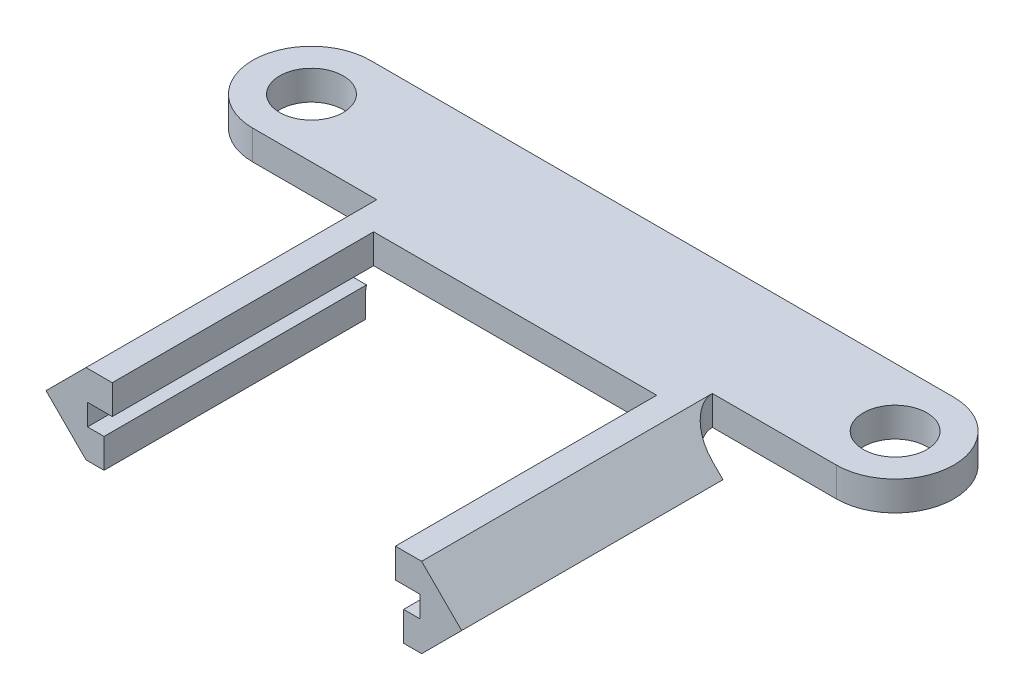
ISO-10303-21;
HEADER;
FILE_DESCRIPTION(('STEP AP214'),'2;1');
FILE_NAME('part.step','',(''),(''),'','','');
FILE_SCHEMA(('AUTOMOTIVE_DESIGN { 1 0 10303 214 1 1 1 1 }'));
ENDSEC;
DATA;
#1=APPLICATION_CONTEXT('core data for automotive mechanical design processes');
#2=APPLICATION_PROTOCOL_DEFINITION('international standard','automotive_design',2000,#1);
#3=PRODUCT_CONTEXT('',#1,'mechanical');
#4=PRODUCT('Part','Part','',(#3));
#5=PRODUCT_RELATED_PRODUCT_CATEGORY('part','',(#4));
#6=PRODUCT_DEFINITION_FORMATION('','',#4);
#7=PRODUCT_DEFINITION_CONTEXT('part definition',#1,'design');
#8=PRODUCT_DEFINITION('design','',#6,#7);
#9=PRODUCT_DEFINITION_SHAPE('','',#8);
#10=(LENGTH_UNIT() NAMED_UNIT(*) SI_UNIT(.MILLI.,.METRE.));
#11=(NAMED_UNIT(*) PLANE_ANGLE_UNIT() SI_UNIT($,.RADIAN.));
#12=(NAMED_UNIT(*) SI_UNIT($,.STERADIAN.) SOLID_ANGLE_UNIT());
#13=UNCERTAINTY_MEASURE_WITH_UNIT(LENGTH_MEASURE(1.E-05),#10,'distance_accuracy_value','');
#14=(GEOMETRIC_REPRESENTATION_CONTEXT(3) GLOBAL_UNCERTAINTY_ASSIGNED_CONTEXT((#13)) GLOBAL_UNIT_ASSIGNED_CONTEXT((#10,
#11,#12)) REPRESENTATION_CONTEXT('',''));
#15=CARTESIAN_POINT('',(0.,0.,0.));
#16=DIRECTION('',(0.,0.,1.));
#17=DIRECTION('',(1.,0.,0.));
#18=AXIS2_PLACEMENT_3D('',#15,#16,#17);
#19=CARTESIAN_POINT('',(0.,0.,0.));
#20=DIRECTION('',(0.,0.,-1.));
#21=DIRECTION('',(-1.,0.,0.));
#22=AXIS2_PLACEMENT_3D('',#19,#20,#21);
#23=PLANE('',#22);
#24=DIRECTION('',(0.,1.,0.));
#25=VECTOR('',#24,1.);
#26=CARTESIAN_POINT('',(26.416,0.,0.));
#27=LINE('',#26,#25);
#28=CARTESIAN_POINT('',(26.416,-2.54,0.));
#29=VERTEX_POINT('',#28);
#30=CARTESIAN_POINT('',(26.416,-0.6985,0.));
#31=VERTEX_POINT('',#30);
#32=EDGE_CURVE('E306',#29,#31,#27,.T.);
#33=ORIENTED_EDGE('',*,*,#32,.T.);
#34=DIRECTION('',(-1.,0.,0.));
#35=VECTOR('',#34,1.);
#36=CARTESIAN_POINT('',(27.9761024484277,-0.6985,0.));
#37=LINE('',#36,#35);
#38=CARTESIAN_POINT('',(29.8176024484277,-0.6985,0.));
#39=VERTEX_POINT('',#38);
#40=EDGE_CURVE('E397',#31,#39,#37,.F.);
#41=ORIENTED_EDGE('',*,*,#40,.T.);
#42=DIRECTION('',(0.707106781186548,0.707106781186547,0.));
#43=VECTOR('',#42,1.);
#44=CARTESIAN_POINT('',(27.9761024484277,-2.54,0.));
#45=LINE('',#44,#43);
#46=CARTESIAN_POINT('',(27.9761024484277,-2.54,0.));
#47=VERTEX_POINT('',#46);
#48=EDGE_CURVE('E345',#47,#39,#45,.T.);
#49=ORIENTED_EDGE('',*,*,#48,.F.);
#50=DIRECTION('',(1.,0.,0.));
#51=VECTOR('',#50,1.);
#52=CARTESIAN_POINT('',(26.0985,-2.54,0.));
#53=LINE('',#52,#51);
#54=EDGE_CURVE('E363',#29,#47,#53,.T.);
#55=ORIENTED_EDGE('',*,*,#54,.F.);
#56=EDGE_LOOP('',(#33,#41,#49,#55));
#57=FACE_BOUND('',#56,.T.);
#58=ADVANCED_FACE('F34',(#57),#23,.T.);
#59=DIRECTION('',(0.707106781186548,-0.707106781186547,0.));
#60=VECTOR('',#59,1.);
#61=CARTESIAN_POINT('',(-1.05210244842766,-2.54,0.));
#62=LINE('',#61,#60);
#63=CARTESIAN_POINT('',(-2.89360244842766,-0.6985,0.));
#64=VERTEX_POINT('',#63);
#65=CARTESIAN_POINT('',(-1.05210244842766,-2.54,0.));
#66=VERTEX_POINT('',#65);
#67=EDGE_CURVE('E340',#64,#66,#62,.T.);
#68=ORIENTED_EDGE('',*,*,#67,.F.);
#69=DIRECTION('',(-1.,0.,0.));
#70=VECTOR('',#69,1.);
#71=CARTESIAN_POINT('',(-0.920750000000008,-0.6985,0.));
#72=LINE('',#71,#70);
#73=CARTESIAN_POINT('',(0.507999999999999,-0.6985,0.));
#74=VERTEX_POINT('',#73);
#75=EDGE_CURVE('E391',#64,#74,#72,.F.);
#76=ORIENTED_EDGE('',*,*,#75,.T.);
#77=DIRECTION('',(0.,-1.,0.));
#78=VECTOR('',#77,1.);
#79=CARTESIAN_POINT('',(0.508,0.,0.));
#80=LINE('',#79,#78);
#81=CARTESIAN_POINT('',(0.507999999999998,-2.54,0.));
#82=VERTEX_POINT('',#81);
#83=EDGE_CURVE('E304',#74,#82,#80,.T.);
#84=ORIENTED_EDGE('',*,*,#83,.T.);
#85=EDGE_CURVE('E364',#66,#82,#53,.T.);
#86=ORIENTED_EDGE('',*,*,#85,.F.);
#87=EDGE_LOOP('',(#68,#76,#84,#86));
#88=FACE_BOUND('',#87,.T.);
#89=ADVANCED_FACE('F488',(#88),#23,.T.);
#90=CARTESIAN_POINT('',(31.4368524484277,0.920749999999997,22.606));
#91=DIRECTION('',(-0.707106781186548,-0.707106781186547,0.));
#92=DIRECTION('',(0.707106781186547,-0.707106781186548,0.));
#93=AXIS2_PLACEMENT_3D('',#90,#91,#92);
#94=PLANE('',#93);
#95=DIRECTION('',(-0.707106781186547,0.707106781186548,0.));
#96=VECTOR('',#95,1.);
#97=CARTESIAN_POINT('',(27.9761024484277,4.3815,0.));
#98=LINE('',#97,#96);
#99=CARTESIAN_POINT('',(31.4368524484277,0.920749999999997,0.));
#100=VERTEX_POINT('',#99);
#101=CARTESIAN_POINT('',(30.5161024484277,1.8415,0.));
#102=VERTEX_POINT('',#101);
#103=EDGE_CURVE('E267',#100,#102,#98,.T.);
#104=ORIENTED_EDGE('',*,*,#103,.T.);
#105=CARTESIAN_POINT('',(30.5161024484277,1.8415,-2.54));
#106=DIRECTION('',(-0.707106781186548,-0.707106781186547,0.));
#107=DIRECTION('',(0.707106781186547,-0.707106781186548,0.));
#108=AXIS2_PLACEMENT_3D('',#105,#106,#107);
#109=ELLIPSE('',#108,3.59210244842766,2.54);
#110=CARTESIAN_POINT('',(27.9761024484277,4.3815,-2.54));
#111=VERTEX_POINT('',#110);
#112=EDGE_CURVE('E12',#102,#111,#109,.T.);
#113=ORIENTED_EDGE('',*,*,#112,.T.);
#114=DIRECTION('',(0.,0.,-1.));
#115=VECTOR('',#114,1.);
#116=CARTESIAN_POINT('',(27.9761024484277,4.3815,22.606));
#117=LINE('',#116,#115);
#118=CARTESIAN_POINT('',(27.9761024484277,4.3815,22.606));
#119=VERTEX_POINT('',#118);
#120=EDGE_CURVE('E51',#119,#111,#117,.T.);
#121=ORIENTED_EDGE('',*,*,#120,.F.);
#122=DIRECTION('',(-0.707106781186547,0.707106781186548,0.));
#123=VECTOR('',#122,1.);
#124=CARTESIAN_POINT('',(31.4368524484277,0.920749999999997,22.606));
#125=LINE('',#124,#123);
#126=CARTESIAN_POINT('',(31.4368524484277,0.920749999999997,22.606));
#127=VERTEX_POINT('',#126);
#128=EDGE_CURVE('E351',#127,#119,#125,.T.);
#129=ORIENTED_EDGE('',*,*,#128,.F.);
#130=DIRECTION('',(0.,0.,-1.));
#131=VECTOR('',#130,1.);
#132=CARTESIAN_POINT('',(31.4368524484277,0.920749999999997,22.606));
#133=LINE('',#132,#131);
#134=EDGE_CURVE('E376',#127,#100,#133,.T.);
#135=ORIENTED_EDGE('',*,*,#134,.T.);
#136=EDGE_LOOP('',(#104,#113,#121,#129,#135));
#137=FACE_BOUND('',#136,.T.);
#138=ADVANCED_FACE('F495',(#137),#94,.F.);
#139=CARTESIAN_POINT('',(-4.51285244842766,0.920749999999996,22.606));
#140=DIRECTION('',(0.707106781186548,-0.707106781186547,0.));
#141=DIRECTION('',(0.707106781186547,0.707106781186548,0.));
#142=AXIS2_PLACEMENT_3D('',#139,#140,#141);
#143=PLANE('',#142);
#144=DIRECTION('',(0.,0.,-1.));
#145=VECTOR('',#144,1.);
#146=CARTESIAN_POINT('',(-1.05210244842766,4.3815,22.606));
#147=LINE('',#146,#145);
#148=CARTESIAN_POINT('',(-1.05210244842766,4.3815,22.606));
#149=VERTEX_POINT('',#148);
#150=CARTESIAN_POINT('',(-1.05210244842767,4.3815,-2.53999999999999));
#151=VERTEX_POINT('',#150);
#152=EDGE_CURVE('E372',#149,#151,#147,.T.);
#153=ORIENTED_EDGE('',*,*,#152,.T.);
#154=CARTESIAN_POINT('',(-3.59210244842767,1.84149999999999,-2.54));
#155=DIRECTION('',(0.707106781186548,-0.707106781186547,0.));
#156=DIRECTION('',(0.707106781186547,0.707106781186548,0.));
#157=AXIS2_PLACEMENT_3D('',#154,#155,#156);
#158=ELLIPSE('',#157,3.59210244842766,2.54);
#159=CARTESIAN_POINT('',(-3.59210244842767,1.8415,0.));
#160=VERTEX_POINT('',#159);
#161=EDGE_CURVE('E413',#151,#160,#158,.T.);
#162=ORIENTED_EDGE('',*,*,#161,.T.);
#163=DIRECTION('',(-0.707106781186547,-0.707106781186548,0.));
#164=VECTOR('',#163,1.);
#165=CARTESIAN_POINT('',(-1.05210244842767,4.3815,0.));
#166=LINE('',#165,#164);
#167=CARTESIAN_POINT('',(-4.51285244842766,0.920750000000001,0.));
#168=VERTEX_POINT('',#167);
#169=EDGE_CURVE('E271',#160,#168,#166,.T.);
#170=ORIENTED_EDGE('',*,*,#169,.T.);
#171=DIRECTION('',(0.,0.,-1.));
#172=VECTOR('',#171,1.);
#173=CARTESIAN_POINT('',(-4.51285244842766,0.920749999999996,22.606));
#174=LINE('',#173,#172);
#175=CARTESIAN_POINT('',(-4.51285244842766,0.920749999999996,22.606));
#176=VERTEX_POINT('',#175);
#177=EDGE_CURVE('E359',#176,#168,#174,.T.);
#178=ORIENTED_EDGE('',*,*,#177,.F.);
#179=DIRECTION('',(-0.707106781186547,-0.707106781186548,0.));
#180=VECTOR('',#179,1.);
#181=CARTESIAN_POINT('',(-4.51285244842766,0.920749999999996,22.606));
#182=LINE('',#181,#180);
#183=EDGE_CURVE('E357',#149,#176,#182,.T.);
#184=ORIENTED_EDGE('',*,*,#183,.F.);
#185=EDGE_LOOP('',(#153,#162,#170,#178,#184));
#186=FACE_BOUND('',#185,.T.);
#187=ADVANCED_FACE('F538',(#186),#143,.F.);
#188=CARTESIAN_POINT('',(27.84475,1.8415,22.606));
#189=DIRECTION('',(-1.,0.,0.));
#190=DIRECTION('',(0.,0.,1.));
#191=AXIS2_PLACEMENT_3D('',#188,#189,#190);
#192=PLANE('',#191);
#193=DIRECTION('',(0.,0.,-1.));
#194=VECTOR('',#193,1.);
#195=CARTESIAN_POINT('',(27.84475,1.8415,22.606));
#196=LINE('',#195,#194);
#197=CARTESIAN_POINT('',(27.84475,1.8415,22.606));
#198=VERTEX_POINT('',#197);
#199=CARTESIAN_POINT('',(27.84475,1.8415,-2.53999999999999));
#200=VERTEX_POINT('',#199);
#201=EDGE_CURVE('E336',#198,#200,#196,.T.);
#202=ORIENTED_EDGE('',*,*,#201,.T.);
#203=CARTESIAN_POINT('',(27.84475,-0.6985,-2.54));
#204=DIRECTION('',(-1.,0.,0.));
#205=DIRECTION('',(0.,0.,1.));
#206=AXIS2_PLACEMENT_3D('',#203,#204,#205);
#207=CIRCLE('',#206,2.54);
#208=CARTESIAN_POINT('',(27.84475,0.,-0.0979316655752571));
#209=VERTEX_POINT('',#208);
#210=EDGE_CURVE('E417',#200,#209,#207,.F.);
#211=ORIENTED_EDGE('',*,*,#210,.T.);
#212=DIRECTION('',(0.,0.,-1.));
#213=VECTOR('',#212,1.);
#214=CARTESIAN_POINT('',(27.84475,0.,22.606));
#215=LINE('',#214,#213);
#216=CARTESIAN_POINT('',(27.84475,0.,22.606));
#217=VERTEX_POINT('',#216);
#218=EDGE_CURVE('E338',#217,#209,#215,.T.);
#219=ORIENTED_EDGE('',*,*,#218,.F.);
#220=DIRECTION('',(0.,1.,0.));
#221=VECTOR('',#220,1.);
#222=CARTESIAN_POINT('',(27.84475,1.8415,22.606));
#223=LINE('',#222,#221);
#224=EDGE_CURVE('E324',#217,#198,#223,.T.);
#225=ORIENTED_EDGE('',*,*,#224,.T.);
#226=EDGE_LOOP('',(#202,#211,#219,#225));
#227=FACE_BOUND('',#226,.T.);
#228=ADVANCED_FACE('F564',(#227),#192,.T.);
#229=CARTESIAN_POINT('',(-0.920750000000006,1.8415,22.606));
#230=DIRECTION('',(1.,0.,0.));
#231=DIRECTION('',(0.,0.,-1.));
#232=AXIS2_PLACEMENT_3D('',#229,#230,#231);
#233=PLANE('',#232);
#234=DIRECTION('',(0.,0.,-1.));
#235=VECTOR('',#234,1.);
#236=CARTESIAN_POINT('',(-0.920750000000006,0.,22.606));
#237=LINE('',#236,#235);
#238=CARTESIAN_POINT('',(-0.920750000000006,0.,22.606));
#239=VERTEX_POINT('',#238);
#240=CARTESIAN_POINT('',(-0.920750000000006,0.,-0.0979316655752571));
#241=VERTEX_POINT('',#240);
#242=EDGE_CURVE('E332',#239,#241,#237,.T.);
#243=ORIENTED_EDGE('',*,*,#242,.T.);
#244=CARTESIAN_POINT('',(-0.920750000000006,-0.6985,-2.54));
#245=DIRECTION('',(1.,0.,0.));
#246=DIRECTION('',(0.,0.,-1.));
#247=AXIS2_PLACEMENT_3D('',#244,#245,#246);
#248=CIRCLE('',#247,2.54);
#249=CARTESIAN_POINT('',(-0.920750000000006,1.8415,-2.53999999999999));
#250=VERTEX_POINT('',#249);
#251=EDGE_CURVE('E410',#241,#250,#248,.F.);
#252=ORIENTED_EDGE('',*,*,#251,.T.);
#253=DIRECTION('',(0.,0.,-1.));
#254=VECTOR('',#253,1.);
#255=CARTESIAN_POINT('',(-0.920750000000006,1.8415,22.606));
#256=LINE('',#255,#254);
#257=CARTESIAN_POINT('',(-0.920750000000006,1.8415,22.606));
#258=VERTEX_POINT('',#257);
#259=EDGE_CURVE('E334',#258,#250,#256,.T.);
#260=ORIENTED_EDGE('',*,*,#259,.F.);
#261=DIRECTION('',(0.,-1.,0.));
#262=VECTOR('',#261,1.);
#263=CARTESIAN_POINT('',(-0.920750000000006,1.8415,22.606));
#264=LINE('',#263,#262);
#265=EDGE_CURVE('E330',#258,#239,#264,.T.);
#266=ORIENTED_EDGE('',*,*,#265,.T.);
#267=EDGE_LOOP('',(#243,#252,#260,#266));
#268=FACE_BOUND('',#267,.T.);
#269=ADVANCED_FACE('F524',(#268),#233,.T.);
#270=CARTESIAN_POINT('',(0.,0.,22.606));
#271=DIRECTION('',(0.,0.,-1.));
#272=DIRECTION('',(-1.,0.,0.));
#273=AXIS2_PLACEMENT_3D('',#270,#271,#272);
#274=PLANE('',#273);
#275=DIRECTION('',(-1.,0.,0.));
#276=VECTOR('',#275,1.);
#277=CARTESIAN_POINT('',(26.924,1.8415,22.606));
#278=LINE('',#277,#276);
#279=CARTESIAN_POINT('',(1.2192,1.8415,22.606));
#280=VERTEX_POINT('',#279);
#281=EDGE_CURVE('E326',#280,#258,#278,.T.);
#282=ORIENTED_EDGE('',*,*,#281,.F.);
#283=DIRECTION('',(0.,1.,0.));
#284=VECTOR('',#283,1.);
#285=CARTESIAN_POINT('',(1.2192,1.8415,22.606));
#286=LINE('',#285,#284);
#287=CARTESIAN_POINT('',(1.2192,4.3815,22.606));
#288=VERTEX_POINT('',#287);
#289=EDGE_CURVE('E284',#280,#288,#286,.T.);
#290=ORIENTED_EDGE('',*,*,#289,.T.);
#291=DIRECTION('',(-1.,0.,0.));
#292=VECTOR('',#291,1.);
#293=CARTESIAN_POINT('',(26.0985,4.3815,22.606));
#294=LINE('',#293,#292);
#295=EDGE_CURVE('E353',#288,#149,#294,.T.);
#296=ORIENTED_EDGE('',*,*,#295,.T.);
#297=ORIENTED_EDGE('',*,*,#183,.T.);
#298=DIRECTION('',(0.707106781186548,-0.707106781186547,0.));
#299=VECTOR('',#298,1.);
#300=CARTESIAN_POINT('',(-1.05210244842766,-2.54,22.606));
#301=LINE('',#300,#299);
#302=CARTESIAN_POINT('',(-1.05210244842766,-2.54,22.606));
#303=VERTEX_POINT('',#302);
#304=EDGE_CURVE('E341',#176,#303,#301,.T.);
#305=ORIENTED_EDGE('',*,*,#304,.T.);
#306=DIRECTION('',(1.,0.,0.));
#307=VECTOR('',#306,1.);
#308=CARTESIAN_POINT('',(0.825500000000002,-2.54,22.606));
#309=LINE('',#308,#307);
#310=CARTESIAN_POINT('',(0.507999999999998,-2.54,22.606));
#311=VERTEX_POINT('',#310);
#312=EDGE_CURVE('E346',#303,#311,#309,.T.);
#313=ORIENTED_EDGE('',*,*,#312,.T.);
#314=DIRECTION('',(0.,-1.,0.));
#315=VECTOR('',#314,1.);
#316=CARTESIAN_POINT('',(0.508,0.,22.606));
#317=LINE('',#316,#315);
#318=CARTESIAN_POINT('',(0.508,0.,22.606));
#319=VERTEX_POINT('',#318);
#320=EDGE_CURVE('E303',#319,#311,#317,.T.);
#321=ORIENTED_EDGE('',*,*,#320,.F.);
#322=DIRECTION('',(1.,0.,0.));
#323=VECTOR('',#322,1.);
#324=CARTESIAN_POINT('',(-0.920750000000006,0.,22.606));
#325=LINE('',#324,#323);
#326=EDGE_CURVE('E321',#239,#319,#325,.T.);
#327=ORIENTED_EDGE('',*,*,#326,.F.);
#328=ORIENTED_EDGE('',*,*,#265,.F.);
#329=EDGE_LOOP('',(#282,#290,#296,#297,#305,#313,#321,#327,#328));
#330=FACE_BOUND('',#329,.T.);
#331=ADVANCED_FACE('F513',(#330),#274,.F.);
#332=ORIENTED_EDGE('',*,*,#169,.F.);
#333=DIRECTION('',(0.,1.,0.));
#334=VECTOR('',#333,1.);
#335=CARTESIAN_POINT('',(-3.59210244842767,0.,0.));
#336=LINE('',#335,#334);
#337=CARTESIAN_POINT('',(-3.59210244842767,0.,0.));
#338=VERTEX_POINT('',#337);
#339=EDGE_CURVE('E389',#160,#338,#336,.F.);
#340=ORIENTED_EDGE('',*,*,#339,.T.);
#341=EDGE_CURVE('E360',#168,#338,#62,.T.);
#342=ORIENTED_EDGE('',*,*,#341,.F.);
#343=EDGE_LOOP('',(#332,#340,#342));
#344=FACE_BOUND('',#343,.T.);
#345=ADVANCED_FACE('F497',(#344),#23,.T.);
#346=CARTESIAN_POINT('',(26.0985,-2.54,22.606));
#347=DIRECTION('',(0.,1.,0.));
#348=DIRECTION('',(0.,0.,1.));
#349=AXIS2_PLACEMENT_3D('',#346,#347,#348);
#350=PLANE('',#349);
#351=ORIENTED_EDGE('',*,*,#85,.T.);
#352=DIRECTION('',(0.,0.,1.));
#353=VECTOR('',#352,1.);
#354=CARTESIAN_POINT('',(0.507999999999998,-2.54,0.));
#355=LINE('',#354,#353);
#356=EDGE_CURVE('E310',#82,#311,#355,.T.);
#357=ORIENTED_EDGE('',*,*,#356,.T.);
#358=ORIENTED_EDGE('',*,*,#312,.F.);
#359=DIRECTION('',(0.,0.,-1.));
#360=VECTOR('',#359,1.);
#361=CARTESIAN_POINT('',(-1.05210244842766,-2.54,22.606));
#362=LINE('',#361,#360);
#363=EDGE_CURVE('E382',#303,#66,#362,.T.);
#364=ORIENTED_EDGE('',*,*,#363,.T.);
#365=EDGE_LOOP('',(#351,#357,#358,#364));
#366=FACE_BOUND('',#365,.T.);
#367=ADVANCED_FACE('F516',(#366),#350,.F.);
#368=CARTESIAN_POINT('',(27.84475,0.,22.606));
#369=DIRECTION('',(0.,1.,0.));
#370=DIRECTION('',(0.,0.,1.));
#371=AXIS2_PLACEMENT_3D('',#368,#369,#370);
#372=PLANE('',#371);
#373=DIRECTION('',(0.,0.,1.));
#374=VECTOR('',#373,1.);
#375=CARTESIAN_POINT('',(0.508,0.,0.));
#376=LINE('',#375,#374);
#377=CARTESIAN_POINT('',(0.508,0.,-0.0979316655752647));
#378=VERTEX_POINT('',#377);
#379=EDGE_CURVE('E313',#378,#319,#376,.T.);
#380=ORIENTED_EDGE('',*,*,#379,.F.);
#381=DIRECTION('',(1.,0.,0.));
#382=VECTOR('',#381,1.);
#383=CARTESIAN_POINT('',(0.508,0.,-0.0979316655752648));
#384=LINE('',#383,#382);
#385=EDGE_CURVE('E407',#378,#241,#384,.F.);
#386=ORIENTED_EDGE('',*,*,#385,.T.);
#387=ORIENTED_EDGE('',*,*,#242,.F.);
#388=ORIENTED_EDGE('',*,*,#326,.T.);
#389=EDGE_LOOP('',(#380,#386,#387,#388));
#390=FACE_BOUND('',#389,.T.);
#391=ADVANCED_FACE('F511',(#390),#372,.T.);
#392=CARTESIAN_POINT('',(25.7048,4.3815,22.606));
#393=VERTEX_POINT('',#392);
#394=EDGE_CURVE('E354',#119,#393,#294,.T.);
#395=ORIENTED_EDGE('',*,*,#394,.T.);
#396=DIRECTION('',(0.,1.,0.));
#397=VECTOR('',#396,1.);
#398=CARTESIAN_POINT('',(25.7048,1.8415,22.606));
#399=LINE('',#398,#397);
#400=CARTESIAN_POINT('',(25.7048,1.8415,22.606));
#401=VERTEX_POINT('',#400);
#402=EDGE_CURVE('E296',#401,#393,#399,.T.);
#403=ORIENTED_EDGE('',*,*,#402,.F.);
#404=EDGE_CURVE('E327',#198,#401,#278,.T.);
#405=ORIENTED_EDGE('',*,*,#404,.F.);
#406=ORIENTED_EDGE('',*,*,#224,.F.);
#407=CARTESIAN_POINT('',(26.416,0.,22.606));
#408=VERTEX_POINT('',#407);
#409=EDGE_CURVE('E315',#408,#217,#325,.T.);
#410=ORIENTED_EDGE('',*,*,#409,.F.);
#411=DIRECTION('',(0.,1.,0.));
#412=VECTOR('',#411,1.);
#413=CARTESIAN_POINT('',(26.416,0.,22.606));
#414=LINE('',#413,#412);
#415=CARTESIAN_POINT('',(26.416,-2.54,22.606));
#416=VERTEX_POINT('',#415);
#417=EDGE_CURVE('E307',#416,#408,#414,.T.);
#418=ORIENTED_EDGE('',*,*,#417,.F.);
#419=CARTESIAN_POINT('',(27.9761024484277,-2.54,22.606));
#420=VERTEX_POINT('',#419);
#421=EDGE_CURVE('E344',#416,#420,#309,.T.);
#422=ORIENTED_EDGE('',*,*,#421,.T.);
#423=DIRECTION('',(0.707106781186548,0.707106781186547,0.));
#424=VECTOR('',#423,1.);
#425=CARTESIAN_POINT('',(27.9761024484277,-2.54,22.606));
#426=LINE('',#425,#424);
#427=EDGE_CURVE('E349',#420,#127,#426,.T.);
#428=ORIENTED_EDGE('',*,*,#427,.T.);
#429=ORIENTED_EDGE('',*,*,#128,.T.);
#430=EDGE_LOOP('',(#395,#403,#405,#406,#410,#418,#422,#428,#429));
#431=FACE_BOUND('',#430,.T.);
#432=ADVANCED_FACE('F502',(#431),#274,.F.);
#433=CARTESIAN_POINT('',(30.5161024484277,0.,0.));
#434=VERTEX_POINT('',#433);
#435=EDGE_CURVE('E367',#434,#100,#45,.T.);
#436=ORIENTED_EDGE('',*,*,#435,.F.);
#437=DIRECTION('',(0.,-1.,0.));
#438=VECTOR('',#437,1.);
#439=CARTESIAN_POINT('',(30.5161024484277,0.,0.));
#440=LINE('',#439,#438);
#441=EDGE_CURVE('E395',#434,#102,#440,.F.);
#442=ORIENTED_EDGE('',*,*,#441,.T.);
#443=ORIENTED_EDGE('',*,*,#103,.F.);
#444=EDGE_LOOP('',(#436,#442,#443));
#445=FACE_BOUND('',#444,.T.);
#446=ADVANCED_FACE('F491',(#445),#23,.T.);
#447=CARTESIAN_POINT('',(-1.05210244842766,-2.54,22.606));
#448=DIRECTION('',(0.707106781186547,0.707106781186548,0.));
#449=DIRECTION('',(-0.707106781186548,0.707106781186547,0.));
#450=AXIS2_PLACEMENT_3D('',#447,#448,#449);
#451=PLANE('',#450);
#452=ORIENTED_EDGE('',*,*,#341,.T.);
#453=CARTESIAN_POINT('',(-3.59210244842767,0.,-2.54));
#454=DIRECTION('',(0.707106781186547,0.707106781186548,0.));
#455=DIRECTION('',(-0.707106781186548,0.707106781186547,0.));
#456=AXIS2_PLACEMENT_3D('',#453,#454,#455);
#457=ELLIPSE('',#456,3.59210244842766,2.54);
#458=CARTESIAN_POINT('',(-3.24285244842766,-0.349249999999998,-0.024125512371494));
#459=VERTEX_POINT('',#458);
#460=EDGE_CURVE('E415',#338,#459,#457,.T.);
#461=ORIENTED_EDGE('',*,*,#460,.T.);
#462=CARTESIAN_POINT('',(-2.89360244842766,-0.6985,-2.54));
#463=DIRECTION('',(0.707106781186547,0.707106781186548,0.));
#464=DIRECTION('',(0.707106781186548,-0.707106781186547,0.));
#465=AXIS2_PLACEMENT_3D('',#462,#463,#464);
#466=ELLIPSE('',#465,3.59210244842766,2.54);
#467=EDGE_CURVE('E402',#459,#64,#466,.T.);
#468=ORIENTED_EDGE('',*,*,#467,.T.);
#469=ORIENTED_EDGE('',*,*,#67,.T.);
#470=ORIENTED_EDGE('',*,*,#363,.F.);
#471=ORIENTED_EDGE('',*,*,#304,.F.);
#472=ORIENTED_EDGE('',*,*,#177,.T.);
#473=EDGE_LOOP('',(#452,#461,#468,#469,#470,#471,#472));
#474=FACE_BOUND('',#473,.T.);
#475=ADVANCED_FACE('F501',(#474),#451,.F.);
#476=ORIENTED_EDGE('',*,*,#421,.F.);
#477=DIRECTION('',(0.,0.,1.));
#478=VECTOR('',#477,1.);
#479=CARTESIAN_POINT('',(26.416,-2.54,0.));
#480=LINE('',#479,#478);
#481=EDGE_CURVE('E317',#29,#416,#480,.T.);
#482=ORIENTED_EDGE('',*,*,#481,.F.);
#483=ORIENTED_EDGE('',*,*,#54,.T.);
#484=DIRECTION('',(0.,0.,-1.));
#485=VECTOR('',#484,1.);
#486=CARTESIAN_POINT('',(27.9761024484277,-2.54,22.606));
#487=LINE('',#486,#485);
#488=EDGE_CURVE('E379',#420,#47,#487,.T.);
#489=ORIENTED_EDGE('',*,*,#488,.F.);
#490=EDGE_LOOP('',(#476,#482,#483,#489));
#491=FACE_BOUND('',#490,.T.);
#492=ADVANCED_FACE('F508',(#491),#350,.F.);
#493=CARTESIAN_POINT('',(27.9761024484277,-2.54,22.606));
#494=DIRECTION('',(-0.707106781186547,0.707106781186548,0.));
#495=DIRECTION('',(-0.707106781186548,-0.707106781186547,0.));
#496=AXIS2_PLACEMENT_3D('',#493,#494,#495);
#497=PLANE('',#496);
#498=ORIENTED_EDGE('',*,*,#48,.T.);
#499=CARTESIAN_POINT('',(29.8176024484277,-0.6985,-2.54));
#500=DIRECTION('',(-0.707106781186547,0.707106781186548,0.));
#501=DIRECTION('',(0.707106781186548,0.707106781186547,0.));
#502=AXIS2_PLACEMENT_3D('',#499,#500,#501);
#503=ELLIPSE('',#502,3.59210244842766,2.54);
#504=CARTESIAN_POINT('',(30.1668524484277,-0.349250000000001,-0.024125512371494));
#505=VERTEX_POINT('',#504);
#506=EDGE_CURVE('E424',#39,#505,#503,.T.);
#507=ORIENTED_EDGE('',*,*,#506,.T.);
#508=CARTESIAN_POINT('',(30.5161024484277,0.,-2.54));
#509=DIRECTION('',(-0.707106781186547,0.707106781186548,0.));
#510=DIRECTION('',(-0.707106781186548,-0.707106781186547,0.));
#511=AXIS2_PLACEMENT_3D('',#508,#509,#510);
#512=ELLIPSE('',#511,3.59210244842766,2.54);
#513=EDGE_CURVE('E43',#505,#434,#512,.T.);
#514=ORIENTED_EDGE('',*,*,#513,.T.);
#515=ORIENTED_EDGE('',*,*,#435,.T.);
#516=ORIENTED_EDGE('',*,*,#134,.F.);
#517=ORIENTED_EDGE('',*,*,#427,.F.);
#518=ORIENTED_EDGE('',*,*,#488,.T.);
#519=EDGE_LOOP('',(#498,#507,#514,#515,#516,#517,#518));
#520=FACE_BOUND('',#519,.T.);
#521=ADVANCED_FACE('F575',(#520),#497,.F.);
#522=CARTESIAN_POINT('',(0.825499999999998,4.3815,22.606));
#523=DIRECTION('',(0.,-1.,0.));
#524=DIRECTION('',(0.,0.,-1.));
#525=AXIS2_PLACEMENT_3D('',#522,#523,#524);
#526=PLANE('',#525);
#527=CARTESIAN_POINT('',(38.70198,4.38150000000001,-7.61999999999999));
#528=DIRECTION('',(0.,-1.,0.));
#529=DIRECTION('',(0.,0.,-1.));
#530=AXIS2_PLACEMENT_3D('',#527,#528,#529);
#531=CIRCLE('',#530,2.75);
#532=CARTESIAN_POINT('',(38.70198,4.38150000000001,-10.37));
#533=VERTEX_POINT('',#532);
#534=EDGE_CURVE('E458',#533,#533,#531,.T.);
#535=ORIENTED_EDGE('',*,*,#534,.T.);
#536=EDGE_LOOP('',(#535));
#537=FACE_BOUND('',#536,.T.);
#538=CARTESIAN_POINT('',(-11.77798,4.38150000000001,-7.62));
#539=DIRECTION('',(0.,-1.,0.));
#540=DIRECTION('',(0.,0.,-1.));
#541=AXIS2_PLACEMENT_3D('',#538,#539,#540);
#542=CIRCLE('',#541,2.75);
#543=CARTESIAN_POINT('',(-11.77798,4.38150000000001,-10.37));
#544=VERTEX_POINT('',#543);
#545=EDGE_CURVE('E247',#544,#544,#542,.T.);
#546=ORIENTED_EDGE('',*,*,#545,.T.);
#547=EDGE_LOOP('',(#546));
#548=FACE_BOUND('',#547,.T.);
#549=ORIENTED_EDGE('',*,*,#120,.T.);
#550=DIRECTION('',(1.,0.,0.));
#551=VECTOR('',#550,1.);
#552=CARTESIAN_POINT('',(27.9761024484277,4.3815,-2.54));
#553=LINE('',#552,#551);
#554=CARTESIAN_POINT('',(38.70198,4.3815,-2.54));
#555=VERTEX_POINT('',#554);
#556=EDGE_CURVE('E447',#111,#555,#553,.T.);
#557=ORIENTED_EDGE('',*,*,#556,.T.);
#558=CARTESIAN_POINT('',(38.70198,4.3815,-7.61999999999999));
#559=DIRECTION('',(0.,-1.,0.));
#560=DIRECTION('',(0.,0.,-1.));
#561=AXIS2_PLACEMENT_3D('',#558,#559,#560);
#562=CIRCLE('',#561,5.07999999999999);
#563=CARTESIAN_POINT('',(38.70198,4.3815,-12.7));
#564=VERTEX_POINT('',#563);
#565=EDGE_CURVE('E260',#555,#564,#562,.F.);
#566=ORIENTED_EDGE('',*,*,#565,.T.);
#567=DIRECTION('',(1.,0.,0.));
#568=VECTOR('',#567,1.);
#569=CARTESIAN_POINT('',(-1.05210244842766,4.3815,-12.7));
#570=LINE('',#569,#568);
#571=CARTESIAN_POINT('',(-11.77798,4.3815,-12.7));
#572=VERTEX_POINT('',#571);
#573=EDGE_CURVE('E301',#572,#564,#570,.T.);
#574=ORIENTED_EDGE('',*,*,#573,.F.);
#575=CARTESIAN_POINT('',(-11.77798,4.3815,-7.62));
#576=DIRECTION('',(0.,-1.,0.));
#577=DIRECTION('',(0.,0.,-1.));
#578=AXIS2_PLACEMENT_3D('',#575,#576,#577);
#579=CIRCLE('',#578,5.07999999999999);
#580=CARTESIAN_POINT('',(-11.77798,4.3815,-2.54000000000001));
#581=VERTEX_POINT('',#580);
#582=EDGE_CURVE('E265',#572,#581,#579,.F.);
#583=ORIENTED_EDGE('',*,*,#582,.T.);
#584=EDGE_CURVE('E239',#581,#151,#553,.T.);
#585=ORIENTED_EDGE('',*,*,#584,.T.);
#586=ORIENTED_EDGE('',*,*,#152,.F.);
#587=ORIENTED_EDGE('',*,*,#295,.F.);
#588=DIRECTION('',(0.,0.,1.));
#589=VECTOR('',#588,1.);
#590=CARTESIAN_POINT('',(1.2192,4.3815,0.));
#591=LINE('',#590,#589);
#592=CARTESIAN_POINT('',(1.2192,4.3815,0.));
#593=VERTEX_POINT('',#592);
#594=EDGE_CURVE('E270',#593,#288,#591,.T.);
#595=ORIENTED_EDGE('',*,*,#594,.F.);
#596=DIRECTION('',(-1.,0.,0.));
#597=VECTOR('',#596,1.);
#598=CARTESIAN_POINT('',(3.048,4.3815,0.));
#599=LINE('',#598,#597);
#600=CARTESIAN_POINT('',(25.7048,4.3815,0.));
#601=VERTEX_POINT('',#600);
#602=EDGE_CURVE('E278',#601,#593,#599,.T.);
#603=ORIENTED_EDGE('',*,*,#602,.F.);
#604=DIRECTION('',(0.,0.,-1.));
#605=VECTOR('',#604,1.);
#606=CARTESIAN_POINT('',(25.7048,4.3815,22.606));
#607=LINE('',#606,#605);
#608=EDGE_CURVE('E286',#393,#601,#607,.T.);
#609=ORIENTED_EDGE('',*,*,#608,.F.);
#610=ORIENTED_EDGE('',*,*,#394,.F.);
#611=EDGE_LOOP('',(#549,#557,#566,#574,#583,#585,#586,#587,#595,#603,#609,#610));
#612=FACE_BOUND('',#611,.T.);
#613=ADVANCED_FACE('F543',(#537,#548,#612),#526,.F.);
#614=DIRECTION('',(0.,0.,1.));
#615=VECTOR('',#614,1.);
#616=CARTESIAN_POINT('',(26.416,0.,0.));
#617=LINE('',#616,#615);
#618=CARTESIAN_POINT('',(26.416,0.,-0.0979316655752647));
#619=VERTEX_POINT('',#618);
#620=EDGE_CURVE('E58',#619,#408,#617,.T.);
#621=ORIENTED_EDGE('',*,*,#620,.T.);
#622=ORIENTED_EDGE('',*,*,#409,.T.);
#623=ORIENTED_EDGE('',*,*,#218,.T.);
#624=DIRECTION('',(1.,0.,0.));
#625=VECTOR('',#624,1.);
#626=CARTESIAN_POINT('',(27.84475,0.,-0.0979316655752648));
#627=LINE('',#626,#625);
#628=EDGE_CURVE('E420',#209,#619,#627,.F.);
#629=ORIENTED_EDGE('',*,*,#628,.T.);
#630=EDGE_LOOP('',(#621,#622,#623,#629));
#631=FACE_BOUND('',#630,.T.);
#632=ADVANCED_FACE('F470',(#631),#372,.T.);
#633=CARTESIAN_POINT('',(0.,1.8415,22.606));
#634=DIRECTION('',(0.,-1.,0.));
#635=DIRECTION('',(0.,0.,-1.));
#636=AXIS2_PLACEMENT_3D('',#633,#634,#635);
#637=PLANE('',#636);
#638=CARTESIAN_POINT('',(38.70198,1.8415,-7.61999999999999));
#639=DIRECTION('',(0.,-1.,0.));
#640=DIRECTION('',(0.,0.,-1.));
#641=AXIS2_PLACEMENT_3D('',#638,#639,#640);
#642=CIRCLE('',#641,2.75);
#643=CARTESIAN_POINT('',(38.70198,1.8415,-10.37));
#644=VERTEX_POINT('',#643);
#645=EDGE_CURVE('E461',#644,#644,#642,.T.);
#646=ORIENTED_EDGE('',*,*,#645,.F.);
#647=EDGE_LOOP('',(#646));
#648=FACE_BOUND('',#647,.T.);
#649=CARTESIAN_POINT('',(-11.77798,1.8415,-7.62));
#650=DIRECTION('',(0.,-1.,0.));
#651=DIRECTION('',(0.,0.,-1.));
#652=AXIS2_PLACEMENT_3D('',#649,#650,#651);
#653=CIRCLE('',#652,2.75);
#654=CARTESIAN_POINT('',(-11.77798,1.8415,-10.37));
#655=VERTEX_POINT('',#654);
#656=EDGE_CURVE('E252',#655,#655,#653,.T.);
#657=ORIENTED_EDGE('',*,*,#656,.F.);
#658=EDGE_LOOP('',(#657));
#659=FACE_BOUND('',#658,.T.);
#660=ORIENTED_EDGE('',*,*,#259,.T.);
#661=DIRECTION('',(-1.,0.,0.));
#662=VECTOR('',#661,1.);
#663=CARTESIAN_POINT('',(-1.05210244842767,1.8415,-2.54));
#664=LINE('',#663,#662);
#665=CARTESIAN_POINT('',(-1.05210244842767,1.8415,-2.54));
#666=VERTEX_POINT('',#665);
#667=EDGE_CURVE('E228',#250,#666,#664,.T.);
#668=ORIENTED_EDGE('',*,*,#667,.T.);
#669=DIRECTION('',(-1.,0.,0.));
#670=VECTOR('',#669,1.);
#671=CARTESIAN_POINT('',(27.9761024484277,1.8415,-2.54));
#672=LINE('',#671,#670);
#673=CARTESIAN_POINT('',(-11.77798,1.8415,-2.54000000000001));
#674=VERTEX_POINT('',#673);
#675=EDGE_CURVE('E222',#666,#674,#672,.T.);
#676=ORIENTED_EDGE('',*,*,#675,.T.);
#677=CARTESIAN_POINT('',(-11.77798,1.8415,-7.62));
#678=DIRECTION('',(0.,-1.,0.));
#679=DIRECTION('',(0.,0.,1.));
#680=AXIS2_PLACEMENT_3D('',#677,#678,#679);
#681=CIRCLE('',#680,5.07999999999999);
#682=CARTESIAN_POINT('',(-11.77798,1.8415,-12.7));
#683=VERTEX_POINT('',#682);
#684=EDGE_CURVE('E226',#674,#683,#681,.T.);
#685=ORIENTED_EDGE('',*,*,#684,.T.);
#686=DIRECTION('',(-1.,0.,0.));
#687=VECTOR('',#686,1.);
#688=CARTESIAN_POINT('',(27.84475,1.8415,-12.7));
#689=LINE('',#688,#687);
#690=CARTESIAN_POINT('',(38.70198,1.8415,-12.7));
#691=VERTEX_POINT('',#690);
#692=EDGE_CURVE('E293',#691,#683,#689,.T.);
#693=ORIENTED_EDGE('',*,*,#692,.F.);
#694=CARTESIAN_POINT('',(38.70198,1.8415,-7.61999999999999));
#695=DIRECTION('',(0.,-1.,0.));
#696=DIRECTION('',(0.,0.,-1.));
#697=AXIS2_PLACEMENT_3D('',#694,#695,#696);
#698=CIRCLE('',#697,5.07999999999999);
#699=CARTESIAN_POINT('',(38.70198,1.8415,-2.54));
#700=VERTEX_POINT('',#699);
#701=EDGE_CURVE('E232',#691,#700,#698,.T.);
#702=ORIENTED_EDGE('',*,*,#701,.T.);
#703=CARTESIAN_POINT('',(27.9761024484277,1.8415,-2.54));
#704=VERTEX_POINT('',#703);
#705=EDGE_CURVE('E231',#700,#704,#672,.T.);
#706=ORIENTED_EDGE('',*,*,#705,.T.);
#707=DIRECTION('',(-1.,0.,0.));
#708=VECTOR('',#707,1.);
#709=CARTESIAN_POINT('',(27.84475,1.8415,-2.54));
#710=LINE('',#709,#708);
#711=EDGE_CURVE('E385',#704,#200,#710,.T.);
#712=ORIENTED_EDGE('',*,*,#711,.T.);
#713=ORIENTED_EDGE('',*,*,#201,.F.);
#714=ORIENTED_EDGE('',*,*,#404,.T.);
#715=DIRECTION('',(0.,0.,-1.));
#716=VECTOR('',#715,1.);
#717=CARTESIAN_POINT('',(25.7048,1.8415,22.606));
#718=LINE('',#717,#716);
#719=CARTESIAN_POINT('',(25.7048,1.8415,0.));
#720=VERTEX_POINT('',#719);
#721=EDGE_CURVE('E277',#401,#720,#718,.T.);
#722=ORIENTED_EDGE('',*,*,#721,.T.);
#723=DIRECTION('',(-1.,0.,0.));
#724=VECTOR('',#723,1.);
#725=CARTESIAN_POINT('',(25.7048,1.8415,0.));
#726=LINE('',#725,#724);
#727=CARTESIAN_POINT('',(1.2192,1.8415,0.));
#728=VERTEX_POINT('',#727);
#729=EDGE_CURVE('E281',#720,#728,#726,.T.);
#730=ORIENTED_EDGE('',*,*,#729,.T.);
#731=DIRECTION('',(0.,0.,1.));
#732=VECTOR('',#731,1.);
#733=CARTESIAN_POINT('',(1.2192,1.8415,0.));
#734=LINE('',#733,#732);
#735=EDGE_CURVE('E274',#728,#280,#734,.T.);
#736=ORIENTED_EDGE('',*,*,#735,.T.);
#737=ORIENTED_EDGE('',*,*,#281,.T.);
#738=EDGE_LOOP('',(#660,#668,#676,#685,#693,#702,#706,#712,#713,#714,#722,#730,#736,#737));
#739=FACE_BOUND('',#738,.T.);
#740=ADVANCED_FACE('F224',(#648,#659,#739),#637,.T.);
#741=CARTESIAN_POINT('',(26.416,0.,0.));
#742=DIRECTION('',(1.,0.,0.));
#743=DIRECTION('',(0.,0.,-1.));
#744=AXIS2_PLACEMENT_3D('',#741,#742,#743);
#745=PLANE('',#744);
#746=ORIENTED_EDGE('',*,*,#417,.T.);
#747=ORIENTED_EDGE('',*,*,#620,.F.);
#748=CARTESIAN_POINT('',(26.416,-0.6985,-2.54));
#749=DIRECTION('',(1.,0.,0.));
#750=DIRECTION('',(0.,0.,-1.));
#751=AXIS2_PLACEMENT_3D('',#748,#749,#750);
#752=CIRCLE('',#751,2.54);
#753=EDGE_CURVE('E422',#619,#31,#752,.T.);
#754=ORIENTED_EDGE('',*,*,#753,.T.);
#755=ORIENTED_EDGE('',*,*,#32,.F.);
#756=ORIENTED_EDGE('',*,*,#481,.T.);
#757=EDGE_LOOP('',(#746,#747,#754,#755,#756));
#758=FACE_BOUND('',#757,.T.);
#759=ADVANCED_FACE('F469',(#758),#745,.F.);
#760=CARTESIAN_POINT('',(0.508,0.,0.));
#761=DIRECTION('',(-1.,0.,0.));
#762=DIRECTION('',(0.,-1.,0.));
#763=AXIS2_PLACEMENT_3D('',#760,#761,#762);
#764=PLANE('',#763);
#765=ORIENTED_EDGE('',*,*,#320,.T.);
#766=ORIENTED_EDGE('',*,*,#356,.F.);
#767=ORIENTED_EDGE('',*,*,#83,.F.);
#768=CARTESIAN_POINT('',(0.507999999999999,-0.6985,-2.54));
#769=DIRECTION('',(-1.,0.,0.));
#770=DIRECTION('',(0.,-1.,0.));
#771=AXIS2_PLACEMENT_3D('',#768,#769,#770);
#772=CIRCLE('',#771,2.54);
#773=EDGE_CURVE('E404',#74,#378,#772,.T.);
#774=ORIENTED_EDGE('',*,*,#773,.T.);
#775=ORIENTED_EDGE('',*,*,#379,.T.);
#776=EDGE_LOOP('',(#765,#766,#767,#774,#775));
#777=FACE_BOUND('',#776,.T.);
#778=ADVANCED_FACE('F548',(#777),#764,.F.);
#779=CARTESIAN_POINT('',(0.,0.,-12.7));
#780=DIRECTION('',(0.,0.,1.));
#781=DIRECTION('',(1.,0.,0.));
#782=AXIS2_PLACEMENT_3D('',#779,#780,#781);
#783=PLANE('',#782);
#784=ORIENTED_EDGE('',*,*,#573,.T.);
#785=DIRECTION('',(0.,-1.,0.));
#786=VECTOR('',#785,1.);
#787=CARTESIAN_POINT('',(38.70198,65.8667043080414,-12.7));
#788=LINE('',#787,#786);
#789=EDGE_CURVE('E261',#564,#691,#788,.T.);
#790=ORIENTED_EDGE('',*,*,#789,.T.);
#791=ORIENTED_EDGE('',*,*,#692,.T.);
#792=DIRECTION('',(0.,-1.,0.));
#793=VECTOR('',#792,1.);
#794=CARTESIAN_POINT('',(-11.77798,65.8667043080414,-12.7));
#795=LINE('',#794,#793);
#796=EDGE_CURVE('E242',#572,#683,#795,.T.);
#797=ORIENTED_EDGE('',*,*,#796,.F.);
#798=EDGE_LOOP('',(#784,#790,#791,#797));
#799=FACE_BOUND('',#798,.T.);
#800=ADVANCED_FACE('F545',(#799),#783,.F.);
#801=CARTESIAN_POINT('',(1.2192,1.8415,0.));
#802=DIRECTION('',(-1.,0.,0.));
#803=DIRECTION('',(0.,0.,1.));
#804=AXIS2_PLACEMENT_3D('',#801,#802,#803);
#805=PLANE('',#804);
#806=ORIENTED_EDGE('',*,*,#594,.T.);
#807=ORIENTED_EDGE('',*,*,#289,.F.);
#808=ORIENTED_EDGE('',*,*,#735,.F.);
#809=DIRECTION('',(0.,1.,0.));
#810=VECTOR('',#809,1.);
#811=CARTESIAN_POINT('',(1.2192,1.8415,0.));
#812=LINE('',#811,#810);
#813=EDGE_CURVE('E291',#728,#593,#812,.T.);
#814=ORIENTED_EDGE('',*,*,#813,.T.);
#815=EDGE_LOOP('',(#806,#807,#808,#814));
#816=FACE_BOUND('',#815,.T.);
#817=ADVANCED_FACE('F547',(#816),#805,.F.);
#818=CARTESIAN_POINT('',(3.048,1.8415,0.));
#819=DIRECTION('',(0.,0.,-1.));
#820=DIRECTION('',(-1.,0.,0.));
#821=AXIS2_PLACEMENT_3D('',#818,#819,#820);
#822=PLANE('',#821);
#823=ORIENTED_EDGE('',*,*,#602,.T.);
#824=ORIENTED_EDGE('',*,*,#813,.F.);
#825=ORIENTED_EDGE('',*,*,#729,.F.);
#826=DIRECTION('',(0.,1.,0.));
#827=VECTOR('',#826,1.);
#828=CARTESIAN_POINT('',(25.7048,1.8415,0.));
#829=LINE('',#828,#827);
#830=EDGE_CURVE('E294',#720,#601,#829,.T.);
#831=ORIENTED_EDGE('',*,*,#830,.T.);
#832=EDGE_LOOP('',(#823,#824,#825,#831));
#833=FACE_BOUND('',#832,.T.);
#834=ADVANCED_FACE('F554',(#833),#822,.F.);
#835=CARTESIAN_POINT('',(25.7048,1.8415,22.606));
#836=DIRECTION('',(1.,0.,0.));
#837=DIRECTION('',(0.,0.,-1.));
#838=AXIS2_PLACEMENT_3D('',#835,#836,#837);
#839=PLANE('',#838);
#840=ORIENTED_EDGE('',*,*,#608,.T.);
#841=ORIENTED_EDGE('',*,*,#830,.F.);
#842=ORIENTED_EDGE('',*,*,#721,.F.);
#843=ORIENTED_EDGE('',*,*,#402,.T.);
#844=EDGE_LOOP('',(#840,#841,#842,#843));
#845=FACE_BOUND('',#844,.T.);
#846=ADVANCED_FACE('F601',(#845),#839,.F.);
#847=CARTESIAN_POINT('',(-3.59210244842767,1.8415,-2.54));
#848=DIRECTION('',(0.,1.,0.));
#849=DIRECTION('',(0.,0.,1.));
#850=AXIS2_PLACEMENT_3D('',#847,#848,#849);
#851=CYLINDRICAL_SURFACE('',#850,2.54);
#852=ORIENTED_EDGE('',*,*,#161,.F.);
#853=DIRECTION('',(0.,1.,0.));
#854=VECTOR('',#853,1.);
#855=CARTESIAN_POINT('',(-1.05210244842767,1.8415,-2.54));
#856=LINE('',#855,#854);
#857=EDGE_CURVE('E393',#666,#151,#856,.T.);
#858=ORIENTED_EDGE('',*,*,#857,.F.);
#859=CARTESIAN_POINT('',(-3.59210244842767,-0.6985,-2.54));
#860=DIRECTION('',(0.707106781186547,-0.707106781186547,0.));
#861=DIRECTION('',(0.707106781186547,0.707106781186547,0.));
#862=AXIS2_PLACEMENT_3D('',#859,#860,#861);
#863=ELLIPSE('',#862,3.59210244842766,2.54);
#864=EDGE_CURVE('E273',#459,#666,#863,.F.);
#865=ORIENTED_EDGE('',*,*,#864,.F.);
#866=ORIENTED_EDGE('',*,*,#460,.F.);
#867=ORIENTED_EDGE('',*,*,#339,.F.);
#868=EDGE_LOOP('',(#852,#858,#865,#866,#867));
#869=FACE_BOUND('',#868,.T.);
#870=ADVANCED_FACE('F533',(#869),#851,.F.);
#871=CARTESIAN_POINT('',(0.,-0.6985,-2.54));
#872=DIRECTION('',(1.,0.,0.));
#873=DIRECTION('',(0.,0.,-1.));
#874=AXIS2_PLACEMENT_3D('',#871,#872,#873);
#875=CYLINDRICAL_SURFACE('',#874,2.54);
#876=ORIENTED_EDGE('',*,*,#773,.F.);
#877=ORIENTED_EDGE('',*,*,#75,.F.);
#878=ORIENTED_EDGE('',*,*,#467,.F.);
#879=ORIENTED_EDGE('',*,*,#864,.T.);
#880=ORIENTED_EDGE('',*,*,#667,.F.);
#881=ORIENTED_EDGE('',*,*,#251,.F.);
#882=ORIENTED_EDGE('',*,*,#385,.F.);
#883=EDGE_LOOP('',(#876,#877,#878,#879,#880,#881,#882));
#884=FACE_BOUND('',#883,.T.);
#885=ADVANCED_FACE('F591',(#884),#875,.F.);
#886=CARTESIAN_POINT('',(30.5161024484277,1.8415,-2.54));
#887=DIRECTION('',(0.,-1.,0.));
#888=DIRECTION('',(0.,0.,-1.));
#889=AXIS2_PLACEMENT_3D('',#886,#887,#888);
#890=CYLINDRICAL_SURFACE('',#889,2.54);
#891=ORIENTED_EDGE('',*,*,#441,.F.);
#892=ORIENTED_EDGE('',*,*,#513,.F.);
#893=CARTESIAN_POINT('',(30.5161024484277,-0.6985,-2.54));
#894=DIRECTION('',(0.707106781186547,0.707106781186547,0.));
#895=DIRECTION('',(0.707106781186547,-0.707106781186547,0.));
#896=AXIS2_PLACEMENT_3D('',#893,#894,#895);
#897=ELLIPSE('',#896,3.59210244842766,2.54);
#898=EDGE_CURVE('E38',#704,#505,#897,.T.);
#899=ORIENTED_EDGE('',*,*,#898,.F.);
#900=DIRECTION('',(0.,-1.,0.));
#901=VECTOR('',#900,1.);
#902=CARTESIAN_POINT('',(27.9761024484277,1.8415,-2.54));
#903=LINE('',#902,#901);
#904=EDGE_CURVE('E399',#111,#704,#903,.T.);
#905=ORIENTED_EDGE('',*,*,#904,.F.);
#906=ORIENTED_EDGE('',*,*,#112,.F.);
#907=EDGE_LOOP('',(#891,#892,#899,#905,#906));
#908=FACE_BOUND('',#907,.T.);
#909=ADVANCED_FACE('F36',(#908),#890,.F.);
#910=CARTESIAN_POINT('',(0.,-0.6985,-2.54));
#911=DIRECTION('',(1.,0.,0.));
#912=DIRECTION('',(0.,0.,-1.));
#913=AXIS2_PLACEMENT_3D('',#910,#911,#912);
#914=CYLINDRICAL_SURFACE('',#913,2.54);
#915=ORIENTED_EDGE('',*,*,#506,.F.);
#916=ORIENTED_EDGE('',*,*,#40,.F.);
#917=ORIENTED_EDGE('',*,*,#753,.F.);
#918=ORIENTED_EDGE('',*,*,#628,.F.);
#919=ORIENTED_EDGE('',*,*,#210,.F.);
#920=ORIENTED_EDGE('',*,*,#711,.F.);
#921=ORIENTED_EDGE('',*,*,#898,.T.);
#922=EDGE_LOOP('',(#915,#916,#917,#918,#919,#920,#921));
#923=FACE_BOUND('',#922,.T.);
#924=ADVANCED_FACE('F434',(#923),#914,.F.);
#925=CARTESIAN_POINT('',(38.70198,65.8667043080414,-7.61999999999999));
#926=DIRECTION('',(0.,-1.,0.));
#927=DIRECTION('',(0.,0.,-1.));
#928=AXIS2_PLACEMENT_3D('',#925,#926,#927);
#929=CYLINDRICAL_SURFACE('',#928,5.07999999999999);
#930=ORIENTED_EDGE('',*,*,#565,.F.);
#931=DIRECTION('',(0.,-1.,0.));
#932=VECTOR('',#931,1.);
#933=CARTESIAN_POINT('',(38.70198,65.8667043080414,-2.54));
#934=LINE('',#933,#932);
#935=EDGE_CURVE('E258',#555,#700,#934,.T.);
#936=ORIENTED_EDGE('',*,*,#935,.T.);
#937=ORIENTED_EDGE('',*,*,#701,.F.);
#938=ORIENTED_EDGE('',*,*,#789,.F.);
#939=EDGE_LOOP('',(#930,#936,#937,#938));
#940=FACE_BOUND('',#939,.T.);
#941=ADVANCED_FACE('F453',(#940),#929,.T.);
#942=CARTESIAN_POINT('',(27.9761024484277,65.8667043080414,-2.54));
#943=DIRECTION('',(0.,0.,1.));
#944=DIRECTION('',(1.,0.,0.));
#945=AXIS2_PLACEMENT_3D('',#942,#943,#944);
#946=PLANE('',#945);
#947=ORIENTED_EDGE('',*,*,#904,.T.);
#948=ORIENTED_EDGE('',*,*,#705,.F.);
#949=ORIENTED_EDGE('',*,*,#935,.F.);
#950=ORIENTED_EDGE('',*,*,#556,.F.);
#951=EDGE_LOOP('',(#947,#948,#949,#950));
#952=FACE_BOUND('',#951,.T.);
#953=ADVANCED_FACE('F445',(#952),#946,.T.);
#954=ORIENTED_EDGE('',*,*,#857,.T.);
#955=ORIENTED_EDGE('',*,*,#584,.F.);
#956=DIRECTION('',(0.,-1.,0.));
#957=VECTOR('',#956,1.);
#958=CARTESIAN_POINT('',(-11.77798,65.8667043080414,-2.54000000000001));
#959=LINE('',#958,#957);
#960=EDGE_CURVE('E236',#581,#674,#959,.T.);
#961=ORIENTED_EDGE('',*,*,#960,.T.);
#962=ORIENTED_EDGE('',*,*,#675,.F.);
#963=EDGE_LOOP('',(#954,#955,#961,#962));
#964=FACE_BOUND('',#963,.T.);
#965=ADVANCED_FACE('F237',(#964),#946,.T.);
#966=CARTESIAN_POINT('',(-11.77798,65.8667043080414,-7.62));
#967=DIRECTION('',(0.,-1.,0.));
#968=DIRECTION('',(0.,0.,-1.));
#969=AXIS2_PLACEMENT_3D('',#966,#967,#968);
#970=CYLINDRICAL_SURFACE('',#969,5.07999999999999);
#971=ORIENTED_EDGE('',*,*,#582,.F.);
#972=ORIENTED_EDGE('',*,*,#796,.T.);
#973=ORIENTED_EDGE('',*,*,#684,.F.);
#974=ORIENTED_EDGE('',*,*,#960,.F.);
#975=EDGE_LOOP('',(#971,#972,#973,#974));
#976=FACE_BOUND('',#975,.T.);
#977=ADVANCED_FACE('F245',(#976),#970,.T.);
#978=CARTESIAN_POINT('',(-11.77798,1.8415,-7.62));
#979=DIRECTION('',(0.,-1.,0.));
#980=DIRECTION('',(0.,0.,-1.));
#981=AXIS2_PLACEMENT_3D('',#978,#979,#980);
#982=CYLINDRICAL_SURFACE('',#981,2.75);
#983=ORIENTED_EDGE('',*,*,#545,.F.);
#984=EDGE_LOOP('',(#983));
#985=FACE_BOUND('',#984,.T.);
#986=ORIENTED_EDGE('',*,*,#656,.T.);
#987=EDGE_LOOP('',(#986));
#988=FACE_BOUND('',#987,.T.);
#989=ADVANCED_FACE('F474',(#985,#988),#982,.F.);
#990=CARTESIAN_POINT('',(38.70198,1.8415,-7.61999999999999));
#991=DIRECTION('',(0.,-1.,0.));
#992=DIRECTION('',(0.,0.,-1.));
#993=AXIS2_PLACEMENT_3D('',#990,#991,#992);
#994=CYLINDRICAL_SURFACE('',#993,2.75);
#995=ORIENTED_EDGE('',*,*,#534,.F.);
#996=EDGE_LOOP('',(#995));
#997=FACE_BOUND('',#996,.T.);
#998=ORIENTED_EDGE('',*,*,#645,.T.);
#999=EDGE_LOOP('',(#998));
#1000=FACE_BOUND('',#999,.T.);
#1001=ADVANCED_FACE('F465',(#997,#1000),#994,.F.);
#1002=CLOSED_SHELL('',(#58,#89,#138,#187,#228,#269,#331,#345,#367,#391,#432,#446,#475,#492,#521,
#613,#632,#740,#759,#778,#800,#817,#834,#846,#870,#885,#909,#924,#941,#953,#965,#977,#989,#1001));
#1003=MANIFOLD_SOLID_BREP('B2',#1002);
#1004=ADVANCED_BREP_SHAPE_REPRESENTATION('',(#18,#1003),#14);
#1005=SHAPE_DEFINITION_REPRESENTATION(#9,#1004);
ENDSEC;
END-ISO-10303-21;
